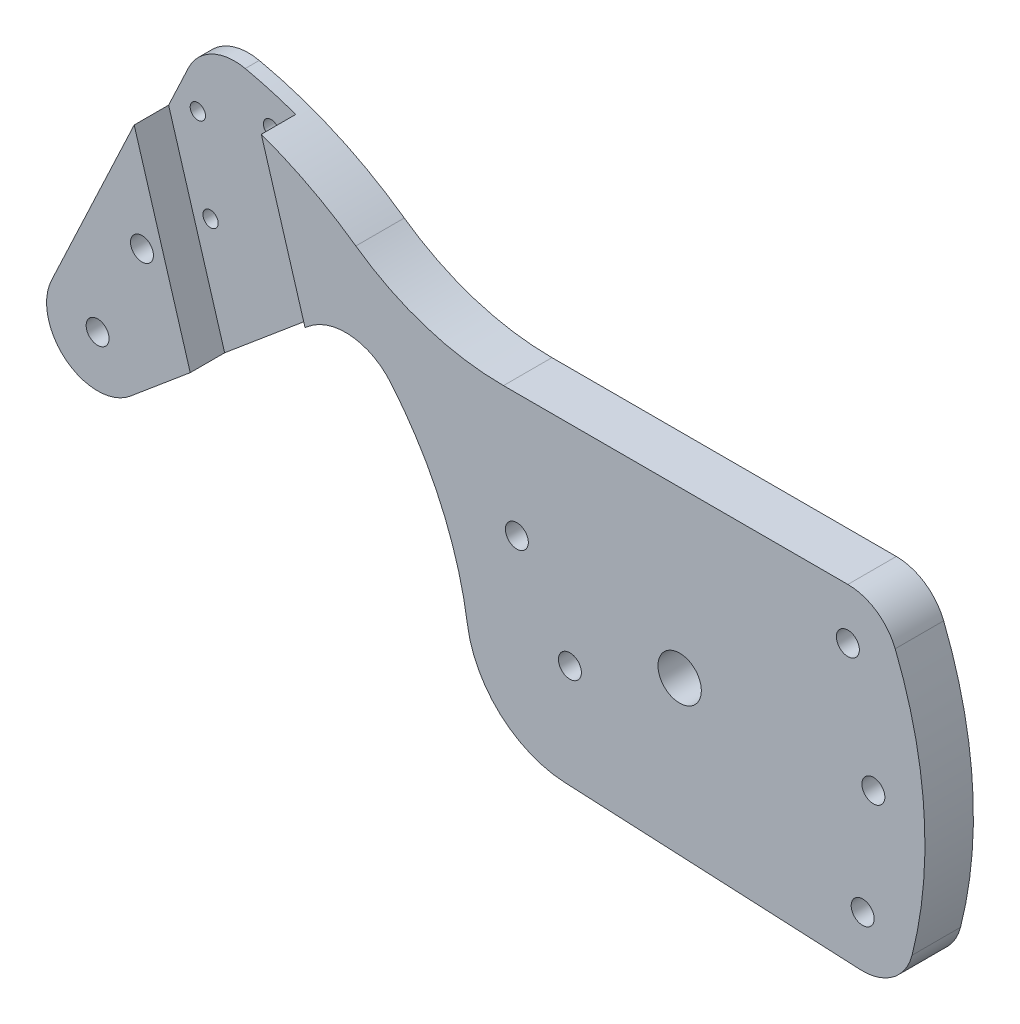
ISO-10303-21;
HEADER;
FILE_DESCRIPTION(('STEP AP214'),'2;1');
FILE_NAME('part.step','',(''),(''),'','','');
FILE_SCHEMA(('AUTOMOTIVE_DESIGN { 1 0 10303 214 1 1 1 1 }'));
ENDSEC;
DATA;
#1=APPLICATION_CONTEXT('core data for automotive mechanical design processes');
#2=APPLICATION_PROTOCOL_DEFINITION('international standard','automotive_design',2000,#1);
#3=PRODUCT_CONTEXT('',#1,'mechanical');
#4=PRODUCT('Part','Part','',(#3));
#5=PRODUCT_RELATED_PRODUCT_CATEGORY('part','',(#4));
#6=PRODUCT_DEFINITION_FORMATION('','',#4);
#7=PRODUCT_DEFINITION_CONTEXT('part definition',#1,'design');
#8=PRODUCT_DEFINITION('design','',#6,#7);
#9=PRODUCT_DEFINITION_SHAPE('','',#8);
#10=(LENGTH_UNIT() NAMED_UNIT(*) SI_UNIT(.MILLI.,.METRE.));
#11=(NAMED_UNIT(*) PLANE_ANGLE_UNIT() SI_UNIT($,.RADIAN.));
#12=(NAMED_UNIT(*) SI_UNIT($,.STERADIAN.) SOLID_ANGLE_UNIT());
#13=UNCERTAINTY_MEASURE_WITH_UNIT(LENGTH_MEASURE(1.E-05),#10,'distance_accuracy_value','');
#14=(GEOMETRIC_REPRESENTATION_CONTEXT(3) GLOBAL_UNCERTAINTY_ASSIGNED_CONTEXT((#13)) GLOBAL_UNIT_ASSIGNED_CONTEXT((#10,
#11,#12)) REPRESENTATION_CONTEXT('',''));
#15=CARTESIAN_POINT('',(0.,0.,0.));
#16=DIRECTION('',(0.,0.,1.));
#17=DIRECTION('',(1.,0.,0.));
#18=AXIS2_PLACEMENT_3D('',#15,#16,#17);
#19=CARTESIAN_POINT('',(-74.1892847970259,-68.5571228840362,-2.));
#20=DIRECTION('',(-0.95769511445002,-0.287784759427187,0.));
#21=DIRECTION('',(0.287784759427187,-0.95769511445002,0.));
#22=AXIS2_PLACEMENT_3D('',#19,#20,#21);
#23=PLANE('',#22);
#24=DIRECTION('',(-0.287784759427187,0.95769511445002,0.));
#25=VECTOR('',#24,1.);
#26=CARTESIAN_POINT('',(-74.1892847970259,-68.5571228840362,-2.));
#27=LINE('',#26,#25);
#28=CARTESIAN_POINT('',(-95.9576660688243,3.88407391520334,-2.));
#29=VERTEX_POINT('',#28);
#30=CARTESIAN_POINT('',(-106.945535827358,40.4496974975837,-2.));
#31=VERTEX_POINT('',#30);
#32=EDGE_CURVE('E11',#29,#31,#27,.T.);
#33=ORIENTED_EDGE('',*,*,#32,.T.);
#34=DIRECTION('',(0.,0.,1.));
#35=VECTOR('',#34,1.);
#36=CARTESIAN_POINT('',(-106.945535827358,40.4496974975837,4.75));
#37=LINE('',#36,#35);
#38=CARTESIAN_POINT('',(-106.945535827358,40.4496974975837,4.75));
#39=VERTEX_POINT('',#38);
#40=EDGE_CURVE('E398',#31,#39,#37,.T.);
#41=ORIENTED_EDGE('',*,*,#40,.T.);
#42=DIRECTION('',(0.287784759427187,-0.95769511445002,0.));
#43=VECTOR('',#42,1.);
#44=CARTESIAN_POINT('',(-86.9399558255523,-26.1252186571247,4.75));
#45=LINE('',#44,#43);
#46=CARTESIAN_POINT('',(-95.9576660688243,3.88407391520334,4.75));
#47=VERTEX_POINT('',#46);
#48=EDGE_CURVE('E66',#39,#47,#45,.T.);
#49=ORIENTED_EDGE('',*,*,#48,.T.);
#50=DIRECTION('',(0.,0.,1.));
#51=VECTOR('',#50,1.);
#52=CARTESIAN_POINT('',(-95.9576660688243,3.88407391520334,4.75));
#53=LINE('',#52,#51);
#54=EDGE_CURVE('E426',#29,#47,#53,.T.);
#55=ORIENTED_EDGE('',*,*,#54,.F.);
#56=EDGE_LOOP('',(#33,#41,#49,#55));
#57=FACE_BOUND('',#56,.T.);
#58=ADVANCED_FACE('F40',(#57),#23,.F.);
#59=CARTESIAN_POINT('',(-48.3315167068753,-60.7869343795021,-2.));
#60=DIRECTION('',(0.95769511445002,0.287784759427187,0.));
#61=DIRECTION('',(-0.287784759427187,0.95769511445002,0.));
#62=AXIS2_PLACEMENT_3D('',#59,#60,#61);
#63=PLANE('',#62);
#64=DIRECTION('',(-0.287784759427187,0.95769511445002,0.));
#65=VECTOR('',#64,1.);
#66=CARTESIAN_POINT('',(-61.0821877354018,-18.3550301525907,4.75));
#67=LINE('',#66,#65);
#68=CARTESIAN_POINT('',(-73.4421904308482,22.7768012188099,4.75));
#69=VERTEX_POINT('',#68);
#70=CARTESIAN_POINT('',(-82.0220970357489,51.329163249051,4.75));
#71=VERTEX_POINT('',#70);
#72=EDGE_CURVE('E396',#69,#71,#67,.T.);
#73=ORIENTED_EDGE('',*,*,#72,.T.);
#74=DIRECTION('',(0.,0.,-1.));
#75=VECTOR('',#74,1.);
#76=CARTESIAN_POINT('',(-82.0220970357489,51.3291632490509,4.75));
#77=LINE('',#76,#75);
#78=CARTESIAN_POINT('',(-82.0220970357489,51.3291632490509,-2.));
#79=VERTEX_POINT('',#78);
#80=EDGE_CURVE('E58',#79,#71,#77,.F.);
#81=ORIENTED_EDGE('',*,*,#80,.F.);
#82=DIRECTION('',(-0.287784759427187,0.95769511445002,0.));
#83=VECTOR('',#82,1.);
#84=CARTESIAN_POINT('',(-48.3315167068753,-60.7869343795021,-2.));
#85=LINE('',#84,#83);
#86=CARTESIAN_POINT('',(-73.4421904308482,22.7768012188099,-2.));
#87=VERTEX_POINT('',#86);
#88=EDGE_CURVE('E50',#87,#79,#85,.T.);
#89=ORIENTED_EDGE('',*,*,#88,.F.);
#90=DIRECTION('',(0.,0.,-1.));
#91=VECTOR('',#90,1.);
#92=CARTESIAN_POINT('',(-73.4421904308482,22.7768012188099,4.75));
#93=LINE('',#92,#91);
#94=EDGE_CURVE('E44',#69,#87,#93,.T.);
#95=ORIENTED_EDGE('',*,*,#94,.F.);
#96=EDGE_LOOP('',(#73,#81,#89,#95));
#97=FACE_BOUND('',#96,.T.);
#98=ADVANCED_FACE('F42',(#97),#63,.F.);
#99=CARTESIAN_POINT('',(0.,0.,-2.));
#100=DIRECTION('',(0.,0.,1.));
#101=DIRECTION('',(1.,0.,0.));
#102=AXIS2_PLACEMENT_3D('',#99,#100,#101);
#103=PLANE('',#102);
#104=DIRECTION('',(0.766044443118982,0.642787609686534,0.));
#105=VECTOR('',#104,1.);
#106=CARTESIAN_POINT('',(-41.5599291638823,49.5291948890183,-2.));
#107=LINE('',#106,#105);
#108=EDGE_CURVE('E206',#29,#87,#107,.T.);
#109=ORIENTED_EDGE('',*,*,#108,.T.);
#110=ORIENTED_EDGE('',*,*,#88,.T.);
#111=CARTESIAN_POINT('',(-108.317782272363,-21.5,-2.));
#112=DIRECTION('',(0.,0.,-1.));
#113=DIRECTION('',(-1.,0.,0.));
#114=AXIS2_PLACEMENT_3D('',#111,#112,#113);
#115=CIRCLE('',#114,77.4309374967139);
#116=CARTESIAN_POINT('',(-91.9187421242096,54.174444588905,-2.));
#117=VERTEX_POINT('',#116);
#118=EDGE_CURVE('E181',#117,#79,#115,.T.);
#119=ORIENTED_EDGE('',*,*,#118,.F.);
#120=CARTESIAN_POINT('',(-94.0366346201967,44.4012909844925,-2.));
#121=DIRECTION('',(0.,0.,1.));
#122=DIRECTION('',(1.,0.,0.));
#123=AXIS2_PLACEMENT_3D('',#120,#121,#122);
#124=CIRCLE('',#123,9.99999999999998);
#125=CARTESIAN_POINT('',(-103.085929893281,48.6569055183213,-2.));
#126=VERTEX_POINT('',#125);
#127=EDGE_CURVE('E437',#117,#126,#124,.T.);
#128=ORIENTED_EDGE('',*,*,#127,.T.);
#129=DIRECTION('',(-0.425561453382882,-0.904929527308425,0.));
#130=VECTOR('',#129,1.);
#131=CARTESIAN_POINT('',(-103.154731418742,48.5106034239492,-2.));
#132=LINE('',#131,#130);
#133=EDGE_CURVE('E405',#126,#31,#132,.T.);
#134=ORIENTED_EDGE('',*,*,#133,.T.);
#135=ORIENTED_EDGE('',*,*,#32,.F.);
#136=EDGE_LOOP('',(#109,#110,#119,#128,#134,#135));
#137=FACE_BOUND('',#136,.T.);
#138=CARTESIAN_POINT('',(-98.7212448544347,25.2426264445703,-2.));
#139=DIRECTION('',(0.,0.,-1.));
#140=DIRECTION('',(-1.,0.,0.));
#141=AXIS2_PLACEMENT_3D('',#138,#139,#140);
#142=CIRCLE('',#141,1.5);
#143=CARTESIAN_POINT('',(-100.221244854435,25.2426264445703,-2.));
#144=VERTEX_POINT('',#143);
#145=EDGE_CURVE('E409',#144,#144,#142,.F.);
#146=ORIENTED_EDGE('',*,*,#145,.F.);
#147=EDGE_LOOP('',(#146));
#148=FACE_BOUND('',#147,.T.);
#149=CARTESIAN_POINT('',(-101.219347978572,42.2429052887889,-2.));
#150=DIRECTION('',(0.,0.,-1.));
#151=DIRECTION('',(-1.,0.,0.));
#152=AXIS2_PLACEMENT_3D('',#149,#150,#151);
#153=CIRCLE('',#152,1.5);
#154=CARTESIAN_POINT('',(-102.719347978572,42.2429052887889,-2.));
#155=VERTEX_POINT('',#154);
#156=EDGE_CURVE('E413',#155,#155,#153,.F.);
#157=ORIENTED_EDGE('',*,*,#156,.F.);
#158=EDGE_LOOP('',(#157));
#159=FACE_BOUND('',#158,.T.);
#160=CARTESIAN_POINT('',(-86.8539212618216,46.5596766801966,-2.));
#161=DIRECTION('',(0.,0.,-1.));
#162=DIRECTION('',(-1.,0.,0.));
#163=AXIS2_PLACEMENT_3D('',#160,#161,#162);
#164=CIRCLE('',#163,1.5);
#165=CARTESIAN_POINT('',(-88.3539212618216,46.5596766801966,-2.));
#166=VERTEX_POINT('',#165);
#167=EDGE_CURVE('E417',#166,#166,#164,.F.);
#168=ORIENTED_EDGE('',*,*,#167,.F.);
#169=EDGE_LOOP('',(#168));
#170=FACE_BOUND('',#169,.T.);
#171=CARTESIAN_POINT('',(-79.5673425654343,30.998321633114,-2.));
#172=DIRECTION('',(0.,0.,-1.));
#173=DIRECTION('',(-1.,0.,0.));
#174=AXIS2_PLACEMENT_3D('',#171,#172,#173);
#175=CIRCLE('',#174,1.5);
#176=CARTESIAN_POINT('',(-81.0673425654343,30.998321633114,-2.));
#177=VERTEX_POINT('',#176);
#178=EDGE_CURVE('E408',#177,#177,#175,.F.);
#179=ORIENTED_EDGE('',*,*,#178,.F.);
#180=EDGE_LOOP('',(#179));
#181=FACE_BOUND('',#180,.T.);
#182=ADVANCED_FACE('F508',(#137,#148,#159,#170,#181),#103,.T.);
#183=CARTESIAN_POINT('',(0.,0.,4.75));
#184=DIRECTION('',(0.,0.,1.));
#185=DIRECTION('',(1.,0.,0.));
#186=AXIS2_PLACEMENT_3D('',#183,#184,#185);
#187=PLANE('',#186);
#188=ORIENTED_EDGE('',*,*,#72,.F.);
#189=DIRECTION('',(0.766044443118982,0.642787609686535,0.));
#190=VECTOR('',#189,1.);
#191=CARTESIAN_POINT('',(-41.5599291638824,49.5291948890183,4.75));
#192=LINE('',#191,#190);
#193=CARTESIAN_POINT('',(-72.8648183450266,23.2612739230748,4.75));
#194=VERTEX_POINT('',#193);
#195=EDGE_CURVE('E215',#69,#194,#192,.T.);
#196=ORIENTED_EDGE('',*,*,#195,.T.);
#197=CARTESIAN_POINT('',(-65.4725042221845,14.4514570095927,4.75));
#198=DIRECTION('',(0.,0.,1.));
#199=DIRECTION('',(1.,0.,0.));
#200=AXIS2_PLACEMENT_3D('',#197,#198,#199);
#201=CIRCLE('',#200,11.5003992165423);
#202=CARTESIAN_POINT('',(-56.6626873087024,21.8437711324349,4.75));
#203=VERTEX_POINT('',#202);
#204=EDGE_CURVE('E219',#203,#194,#201,.T.);
#205=ORIENTED_EDGE('',*,*,#204,.F.);
#206=CARTESIAN_POINT('',(-108.317782272363,-21.5,4.75));
#207=DIRECTION('',(0.,0.,1.));
#208=DIRECTION('',(1.,0.,0.));
#209=AXIS2_PLACEMENT_3D('',#206,#207,#208);
#210=CIRCLE('',#209,67.4309374967139);
#211=CARTESIAN_POINT('',(-41.6082780723541,-11.662653758524,4.75));
#212=VERTEX_POINT('',#211);
#213=EDGE_CURVE('E223',#212,#203,#210,.T.);
#214=ORIENTED_EDGE('',*,*,#213,.F.);
#215=CARTESIAN_POINT('',(-21.5177822723635,-8.70000000000001,4.75));
#216=DIRECTION('',(0.,0.,1.));
#217=DIRECTION('',(1.,0.,0.));
#218=AXIS2_PLACEMENT_3D('',#215,#216,#217);
#219=CIRCLE('',#218,20.3077654797946);
#220=CARTESIAN_POINT('',(-22.5002308320871,-28.9839871230938,4.75));
#221=VERTEX_POINT('',#220);
#222=EDGE_CURVE('E227',#212,#221,#219,.T.);
#223=ORIENTED_EDGE('',*,*,#222,.T.);
#224=DIRECTION('',(-0.998829100290503,0.0483779744601208,0.));
#225=VECTOR('',#224,1.);
#226=CARTESIAN_POINT('',(-1.45320494845944,-30.0033932260633,4.75));
#227=LINE('',#226,#225);
#228=CARTESIAN_POINT('',(35.3984379830354,-31.788291002905,4.75));
#229=VERTEX_POINT('',#228);
#230=EDGE_CURVE('E230',#229,#221,#227,.T.);
#231=ORIENTED_EDGE('',*,*,#230,.F.);
#232=CARTESIAN_POINT('',(35.8822177276366,-21.8,4.75));
#233=DIRECTION('',(0.,0.,1.));
#234=DIRECTION('',(1.,0.,0.));
#235=AXIS2_PLACEMENT_3D('',#232,#233,#234);
#236=CIRCLE('',#235,9.99999999999999);
#237=CARTESIAN_POINT('',(45.5722671365024,-24.2704134175759,4.75));
#238=VERTEX_POINT('',#237);
#239=EDGE_CURVE('E234',#229,#238,#236,.T.);
#240=ORIENTED_EDGE('',*,*,#239,.T.);
#241=CARTESIAN_POINT('',(-33.3576699128129,-4.14775280898879,4.75));
#242=DIRECTION('',(0.,0.,1.));
#243=DIRECTION('',(1.,0.,0.));
#244=AXIS2_PLACEMENT_3D('',#241,#242,#243);
#245=CIRCLE('',#244,81.4546280611314);
#246=CARTESIAN_POINT('',(42.2664151883936,26.1153300673927,4.75));
#247=VERTEX_POINT('',#246);
#248=EDGE_CURVE('E237',#238,#247,#245,.T.);
#249=ORIENTED_EDGE('',*,*,#248,.T.);
#250=CARTESIAN_POINT('',(32.9822177276365,22.4,4.75));
#251=DIRECTION('',(0.,0.,1.));
#252=DIRECTION('',(1.,0.,0.));
#253=AXIS2_PLACEMENT_3D('',#250,#251,#252);
#254=CIRCLE('',#253,9.99999999999999);
#255=CARTESIAN_POINT('',(32.9822177276365,32.4,4.75));
#256=VERTEX_POINT('',#255);
#257=EDGE_CURVE('E240',#247,#256,#254,.T.);
#258=ORIENTED_EDGE('',*,*,#257,.T.);
#259=DIRECTION('',(1.,0.,0.));
#260=VECTOR('',#259,1.);
#261=CARTESIAN_POINT('',(0.,32.4,4.75));
#262=LINE('',#261,#260);
#263=CARTESIAN_POINT('',(-34.5381520802066,32.4,4.75));
#264=VERTEX_POINT('',#263);
#265=EDGE_CURVE('E195',#264,#256,#262,.T.);
#266=ORIENTED_EDGE('',*,*,#265,.F.);
#267=CARTESIAN_POINT('',(-34.5381520802066,82.4,4.75));
#268=DIRECTION('',(0.,0.,1.));
#269=DIRECTION('',(1.,0.,0.));
#270=AXIS2_PLACEMENT_3D('',#267,#268,#269);
#271=CIRCLE('',#270,50.);
#272=CARTESIAN_POINT('',(-63.4870210289497,41.6328197370912,4.75));
#273=VERTEX_POINT('',#272);
#274=EDGE_CURVE('E174',#273,#264,#271,.T.);
#275=ORIENTED_EDGE('',*,*,#274,.F.);
#276=CARTESIAN_POINT('',(-108.317782272363,-21.5,4.75));
#277=DIRECTION('',(0.,0.,1.));
#278=DIRECTION('',(1.,0.,0.));
#279=AXIS2_PLACEMENT_3D('',#276,#277,#278);
#280=CIRCLE('',#279,77.4309374967139);
#281=EDGE_CURVE('E185',#273,#71,#280,.T.);
#282=ORIENTED_EDGE('',*,*,#281,.T.);
#283=EDGE_LOOP('',(#188,#196,#205,#214,#223,#231,#240,#249,#258,#266,#275,#282));
#284=FACE_BOUND('',#283,.T.);
#285=CARTESIAN_POINT('',(0.,0.,4.75));
#286=DIRECTION('',(0.,0.,1.));
#287=DIRECTION('',(1.,0.,0.));
#288=AXIS2_PLACEMENT_3D('',#285,#286,#287);
#289=CIRCLE('',#288,4.25);
#290=CARTESIAN_POINT('',(4.25,0.,4.75));
#291=VERTEX_POINT('',#290);
#292=EDGE_CURVE('E264',#291,#291,#289,.T.);
#293=ORIENTED_EDGE('',*,*,#292,.F.);
#294=EDGE_LOOP('',(#293));
#295=FACE_BOUND('',#294,.T.);
#296=CARTESIAN_POINT('',(-31.9177822723635,8.19999999999999,4.75));
#297=DIRECTION('',(0.,0.,1.));
#298=DIRECTION('',(1.,0.,0.));
#299=AXIS2_PLACEMENT_3D('',#296,#297,#298);
#300=CIRCLE('',#299,2.25);
#301=CARTESIAN_POINT('',(-29.6677822723635,8.19999999999999,4.75));
#302=VERTEX_POINT('',#301);
#303=EDGE_CURVE('E260',#302,#302,#300,.T.);
#304=ORIENTED_EDGE('',*,*,#303,.F.);
#305=EDGE_LOOP('',(#304));
#306=FACE_BOUND('',#305,.T.);
#307=CARTESIAN_POINT('',(-21.5177822723635,-8.70000000000001,4.75));
#308=DIRECTION('',(0.,0.,1.));
#309=DIRECTION('',(1.,0.,0.));
#310=AXIS2_PLACEMENT_3D('',#307,#308,#309);
#311=CIRCLE('',#310,2.25);
#312=CARTESIAN_POINT('',(-19.2677822723635,-8.70000000000001,4.75));
#313=VERTEX_POINT('',#312);
#314=EDGE_CURVE('E256',#313,#313,#311,.T.);
#315=ORIENTED_EDGE('',*,*,#314,.F.);
#316=EDGE_LOOP('',(#315));
#317=FACE_BOUND('',#316,.T.);
#318=CARTESIAN_POINT('',(32.9822177276365,22.4,4.75));
#319=DIRECTION('',(0.,0.,1.));
#320=DIRECTION('',(1.,0.,0.));
#321=AXIS2_PLACEMENT_3D('',#318,#319,#320);
#322=CIRCLE('',#321,2.25);
#323=CARTESIAN_POINT('',(35.2322177276365,22.4,4.75));
#324=VERTEX_POINT('',#323);
#325=EDGE_CURVE('E252',#324,#324,#322,.T.);
#326=ORIENTED_EDGE('',*,*,#325,.F.);
#327=EDGE_LOOP('',(#326));
#328=FACE_BOUND('',#327,.T.);
#329=CARTESIAN_POINT('',(37.9822177276365,-0.100000000000011,4.75));
#330=DIRECTION('',(0.,0.,1.));
#331=DIRECTION('',(1.,0.,0.));
#332=AXIS2_PLACEMENT_3D('',#329,#330,#331);
#333=CIRCLE('',#332,2.25);
#334=CARTESIAN_POINT('',(40.2322177276366,-0.100000000000011,4.75));
#335=VERTEX_POINT('',#334);
#336=EDGE_CURVE('E248',#335,#335,#333,.T.);
#337=ORIENTED_EDGE('',*,*,#336,.F.);
#338=EDGE_LOOP('',(#337));
#339=FACE_BOUND('',#338,.T.);
#340=CARTESIAN_POINT('',(35.8822177276366,-21.8,4.75));
#341=DIRECTION('',(0.,0.,1.));
#342=DIRECTION('',(1.,0.,0.));
#343=AXIS2_PLACEMENT_3D('',#340,#341,#342);
#344=CIRCLE('',#343,2.25);
#345=CARTESIAN_POINT('',(38.1322177276366,-21.8,4.75));
#346=VERTEX_POINT('',#345);
#347=EDGE_CURVE('E244',#346,#346,#344,.T.);
#348=ORIENTED_EDGE('',*,*,#347,.F.);
#349=EDGE_LOOP('',(#348));
#350=FACE_BOUND('',#349,.T.);
#351=ADVANCED_FACE('F192',(#284,#295,#306,#317,#328,#339,#350),#187,.T.);
#352=CARTESIAN_POINT('',(-79.5673425654343,30.998321633114,-4.75));
#353=DIRECTION('',(0.,0.,1.));
#354=DIRECTION('',(1.,0.,0.));
#355=AXIS2_PLACEMENT_3D('',#352,#353,#354);
#356=CYLINDRICAL_SURFACE('',#355,1.5);
#357=ORIENTED_EDGE('',*,*,#178,.T.);
#358=EDGE_LOOP('',(#357));
#359=FACE_BOUND('',#358,.T.);
#360=CARTESIAN_POINT('',(-79.5673425654343,30.998321633114,-4.75));
#361=DIRECTION('',(0.,0.,1.));
#362=DIRECTION('',(1.,0.,0.));
#363=AXIS2_PLACEMENT_3D('',#360,#361,#362);
#364=CIRCLE('',#363,1.5);
#365=CARTESIAN_POINT('',(-78.0673425654343,30.998321633114,-4.75));
#366=VERTEX_POINT('',#365);
#367=EDGE_CURVE('E965',#366,#366,#364,.T.);
#368=ORIENTED_EDGE('',*,*,#367,.F.);
#369=EDGE_LOOP('',(#368));
#370=FACE_BOUND('',#369,.T.);
#371=ADVANCED_FACE('F564',(#359,#370),#356,.F.);
#372=CARTESIAN_POINT('',(-86.8539212618216,46.5596766801966,-4.75));
#373=DIRECTION('',(0.,0.,1.));
#374=DIRECTION('',(1.,0.,0.));
#375=AXIS2_PLACEMENT_3D('',#372,#373,#374);
#376=CYLINDRICAL_SURFACE('',#375,1.5);
#377=ORIENTED_EDGE('',*,*,#167,.T.);
#378=EDGE_LOOP('',(#377));
#379=FACE_BOUND('',#378,.T.);
#380=CARTESIAN_POINT('',(-86.8539212618216,46.5596766801966,-4.75));
#381=DIRECTION('',(0.,0.,1.));
#382=DIRECTION('',(1.,0.,0.));
#383=AXIS2_PLACEMENT_3D('',#380,#381,#382);
#384=CIRCLE('',#383,1.5);
#385=CARTESIAN_POINT('',(-85.3539212618216,46.5596766801966,-4.75));
#386=VERTEX_POINT('',#385);
#387=EDGE_CURVE('E962',#386,#386,#384,.T.);
#388=ORIENTED_EDGE('',*,*,#387,.F.);
#389=EDGE_LOOP('',(#388));
#390=FACE_BOUND('',#389,.T.);
#391=ADVANCED_FACE('F557',(#379,#390),#376,.F.);
#392=CARTESIAN_POINT('',(-101.219347978572,42.2429052887889,-4.75));
#393=DIRECTION('',(0.,0.,1.));
#394=DIRECTION('',(1.,0.,0.));
#395=AXIS2_PLACEMENT_3D('',#392,#393,#394);
#396=CYLINDRICAL_SURFACE('',#395,1.5);
#397=ORIENTED_EDGE('',*,*,#156,.T.);
#398=EDGE_LOOP('',(#397));
#399=FACE_BOUND('',#398,.T.);
#400=CARTESIAN_POINT('',(-101.219347978572,42.2429052887889,-4.75));
#401=DIRECTION('',(0.,0.,1.));
#402=DIRECTION('',(1.,0.,0.));
#403=AXIS2_PLACEMENT_3D('',#400,#401,#402);
#404=CIRCLE('',#403,1.5);
#405=CARTESIAN_POINT('',(-99.7193479785719,42.2429052887889,-4.75));
#406=VERTEX_POINT('',#405);
#407=EDGE_CURVE('E958',#406,#406,#404,.T.);
#408=ORIENTED_EDGE('',*,*,#407,.F.);
#409=EDGE_LOOP('',(#408));
#410=FACE_BOUND('',#409,.T.);
#411=ADVANCED_FACE('F551',(#399,#410),#396,.F.);
#412=CARTESIAN_POINT('',(-98.7212448544347,25.2426264445703,-4.75));
#413=DIRECTION('',(0.,0.,1.));
#414=DIRECTION('',(1.,0.,0.));
#415=AXIS2_PLACEMENT_3D('',#412,#413,#414);
#416=CYLINDRICAL_SURFACE('',#415,1.5);
#417=ORIENTED_EDGE('',*,*,#145,.T.);
#418=EDGE_LOOP('',(#417));
#419=FACE_BOUND('',#418,.T.);
#420=CARTESIAN_POINT('',(-98.7212448544347,25.2426264445703,-4.75));
#421=DIRECTION('',(0.,0.,1.));
#422=DIRECTION('',(1.,0.,0.));
#423=AXIS2_PLACEMENT_3D('',#420,#421,#422);
#424=CIRCLE('',#423,1.5);
#425=CARTESIAN_POINT('',(-97.2212448544347,25.2426264445703,-4.75));
#426=VERTEX_POINT('',#425);
#427=EDGE_CURVE('E441',#426,#426,#424,.T.);
#428=ORIENTED_EDGE('',*,*,#427,.F.);
#429=EDGE_LOOP('',(#428));
#430=FACE_BOUND('',#429,.T.);
#431=ADVANCED_FACE('F546',(#419,#430),#416,.F.);
#432=CARTESIAN_POINT('',(-94.0366346201967,44.4012909844925,4.75));
#433=DIRECTION('',(0.,0.,-1.));
#434=DIRECTION('',(-1.,0.,0.));
#435=AXIS2_PLACEMENT_3D('',#432,#433,#434);
#436=CYLINDRICAL_SURFACE('',#435,9.99999999999999);
#437=DIRECTION('',(0.,0.,-1.));
#438=VECTOR('',#437,1.);
#439=CARTESIAN_POINT('',(-103.085929893281,48.6569055183213,4.75));
#440=LINE('',#439,#438);
#441=CARTESIAN_POINT('',(-103.085929893281,48.6569055183213,-4.75));
#442=VERTEX_POINT('',#441);
#443=EDGE_CURVE('E389',#126,#442,#440,.T.);
#444=ORIENTED_EDGE('',*,*,#443,.F.);
#445=ORIENTED_EDGE('',*,*,#127,.F.);
#446=DIRECTION('',(0.,0.,-1.));
#447=VECTOR('',#446,1.);
#448=CARTESIAN_POINT('',(-91.9187421242096,54.174444588905,4.75));
#449=LINE('',#448,#447);
#450=CARTESIAN_POINT('',(-91.9187421242096,54.174444588905,-4.75));
#451=VERTEX_POINT('',#450);
#452=EDGE_CURVE('E182',#117,#451,#449,.T.);
#453=ORIENTED_EDGE('',*,*,#452,.T.);
#454=CARTESIAN_POINT('',(-94.0366346201967,44.4012909844925,-4.75));
#455=DIRECTION('',(0.,0.,1.));
#456=DIRECTION('',(1.,0.,0.));
#457=AXIS2_PLACEMENT_3D('',#454,#455,#456);
#458=CIRCLE('',#457,9.99999999999999);
#459=EDGE_CURVE('E282',#451,#442,#458,.T.);
#460=ORIENTED_EDGE('',*,*,#459,.T.);
#461=EDGE_LOOP('',(#444,#445,#453,#460));
#462=FACE_BOUND('',#461,.T.);
#463=ADVANCED_FACE('F505',(#462),#436,.T.);
#464=CARTESIAN_POINT('',(-41.5599291638824,49.5291948890183,4.75));
#465=DIRECTION('',(-0.642787609686535,0.766044443118982,0.));
#466=DIRECTION('',(-0.766044443118982,-0.642787609686535,0.));
#467=AXIS2_PLACEMENT_3D('',#464,#465,#466);
#468=PLANE('',#467);
#469=ORIENTED_EDGE('',*,*,#195,.F.);
#470=ORIENTED_EDGE('',*,*,#94,.T.);
#471=ORIENTED_EDGE('',*,*,#108,.F.);
#472=ORIENTED_EDGE('',*,*,#54,.T.);
#473=CARTESIAN_POINT('',(-107.689906175498,-5.96044443118984,4.75));
#474=VERTEX_POINT('',#473);
#475=EDGE_CURVE('E216',#474,#47,#192,.T.);
#476=ORIENTED_EDGE('',*,*,#475,.F.);
#477=DIRECTION('',(0.,0.,-1.));
#478=VECTOR('',#477,1.);
#479=CARTESIAN_POINT('',(-107.689906175498,-5.96044443118984,4.75));
#480=LINE('',#479,#478);
#481=CARTESIAN_POINT('',(-107.689906175498,-5.96044443118984,-4.75));
#482=VERTEX_POINT('',#481);
#483=EDGE_CURVE('E382',#474,#482,#480,.T.);
#484=ORIENTED_EDGE('',*,*,#483,.T.);
#485=DIRECTION('',(0.766044443118982,0.642787609686535,0.));
#486=VECTOR('',#485,1.);
#487=CARTESIAN_POINT('',(-41.5599291638824,49.5291948890183,-4.75));
#488=LINE('',#487,#486);
#489=CARTESIAN_POINT('',(-72.8648183450266,23.2612739230748,-4.75));
#490=VERTEX_POINT('',#489);
#491=EDGE_CURVE('E293',#482,#490,#488,.T.);
#492=ORIENTED_EDGE('',*,*,#491,.T.);
#493=DIRECTION('',(0.,0.,-1.));
#494=VECTOR('',#493,1.);
#495=CARTESIAN_POINT('',(-72.8648183450266,23.2612739230748,4.75));
#496=LINE('',#495,#494);
#497=EDGE_CURVE('E379',#194,#490,#496,.T.);
#498=ORIENTED_EDGE('',*,*,#497,.F.);
#499=EDGE_LOOP('',(#469,#470,#471,#472,#476,#484,#492,#498));
#500=FACE_BOUND('',#499,.T.);
#501=ADVANCED_FACE('F462',(#500),#468,.F.);
#502=CARTESIAN_POINT('',(-34.5381520802066,82.4,4.75));
#503=DIRECTION('',(0.,0.,-1.));
#504=DIRECTION('',(-1.,0.,0.));
#505=AXIS2_PLACEMENT_3D('',#502,#503,#504);
#506=CYLINDRICAL_SURFACE('',#505,50.);
#507=CARTESIAN_POINT('',(-34.5381520802066,82.4,-4.75));
#508=DIRECTION('',(0.,0.,1.));
#509=DIRECTION('',(1.,0.,0.));
#510=AXIS2_PLACEMENT_3D('',#507,#508,#509);
#511=CIRCLE('',#510,50.);
#512=CARTESIAN_POINT('',(-63.4870210289497,41.6328197370912,-4.75));
#513=VERTEX_POINT('',#512);
#514=CARTESIAN_POINT('',(-34.5381520802066,32.4,-4.75));
#515=VERTEX_POINT('',#514);
#516=EDGE_CURVE('E177',#513,#515,#511,.T.);
#517=ORIENTED_EDGE('',*,*,#516,.F.);
#518=DIRECTION('',(0.,0.,-1.));
#519=VECTOR('',#518,1.);
#520=CARTESIAN_POINT('',(-63.4870210289497,41.6328197370912,4.75));
#521=LINE('',#520,#519);
#522=EDGE_CURVE('E171',#273,#513,#521,.T.);
#523=ORIENTED_EDGE('',*,*,#522,.F.);
#524=ORIENTED_EDGE('',*,*,#274,.T.);
#525=DIRECTION('',(0.,0.,-1.));
#526=VECTOR('',#525,1.);
#527=CARTESIAN_POINT('',(-34.5381520802066,32.4,4.75));
#528=LINE('',#527,#526);
#529=EDGE_CURVE('E276',#264,#515,#528,.T.);
#530=ORIENTED_EDGE('',*,*,#529,.T.);
#531=EDGE_LOOP('',(#517,#523,#524,#530));
#532=FACE_BOUND('',#531,.T.);
#533=ADVANCED_FACE('F172',(#532),#506,.F.);
#534=CARTESIAN_POINT('',(-108.317782272363,-21.5,4.75));
#535=DIRECTION('',(0.,0.,-1.));
#536=DIRECTION('',(-1.,0.,0.));
#537=AXIS2_PLACEMENT_3D('',#534,#535,#536);
#538=CYLINDRICAL_SURFACE('',#537,77.4309374967139);
#539=ORIENTED_EDGE('',*,*,#118,.T.);
#540=ORIENTED_EDGE('',*,*,#80,.T.);
#541=ORIENTED_EDGE('',*,*,#281,.F.);
#542=ORIENTED_EDGE('',*,*,#522,.T.);
#543=CARTESIAN_POINT('',(-108.317782272363,-21.5,-4.75));
#544=DIRECTION('',(0.,0.,1.));
#545=DIRECTION('',(1.,0.,0.));
#546=AXIS2_PLACEMENT_3D('',#543,#544,#545);
#547=CIRCLE('',#546,77.4309374967139);
#548=EDGE_CURVE('E279',#513,#451,#547,.T.);
#549=ORIENTED_EDGE('',*,*,#548,.T.);
#550=ORIENTED_EDGE('',*,*,#452,.F.);
#551=EDGE_LOOP('',(#539,#540,#541,#542,#549,#550));
#552=FACE_BOUND('',#551,.T.);
#553=ADVANCED_FACE('F186',(#552),#538,.T.);
#554=CARTESIAN_POINT('',(-103.154731418742,48.5106034239492,4.75));
#555=DIRECTION('',(-0.904929527308425,0.425561453382882,0.));
#556=DIRECTION('',(-0.425561453382882,-0.904929527308425,0.));
#557=AXIS2_PLACEMENT_3D('',#554,#555,#556);
#558=PLANE('',#557);
#559=ORIENTED_EDGE('',*,*,#133,.F.);
#560=ORIENTED_EDGE('',*,*,#443,.T.);
#561=DIRECTION('',(0.425561453382882,0.904929527308425,0.));
#562=VECTOR('',#561,1.);
#563=CARTESIAN_POINT('',(-103.154731418742,48.5106034239492,-4.75));
#564=LINE('',#563,#562);
#565=CARTESIAN_POINT('',(-123.167077545448,5.9556145338288,-4.75));
#566=VERTEX_POINT('',#565);
#567=EDGE_CURVE('E286',#566,#442,#564,.T.);
#568=ORIENTED_EDGE('',*,*,#567,.F.);
#569=DIRECTION('',(0.,0.,-1.));
#570=VECTOR('',#569,1.);
#571=CARTESIAN_POINT('',(-123.167077545448,5.9556145338288,4.75));
#572=LINE('',#571,#570);
#573=CARTESIAN_POINT('',(-123.167077545448,5.9556145338288,4.75));
#574=VERTEX_POINT('',#573);
#575=EDGE_CURVE('E386',#574,#566,#572,.T.);
#576=ORIENTED_EDGE('',*,*,#575,.F.);
#577=DIRECTION('',(0.425561453382882,0.904929527308425,0.));
#578=VECTOR('',#577,1.);
#579=CARTESIAN_POINT('',(-103.154731418742,48.5106034239492,4.75));
#580=LINE('',#579,#578);
#581=EDGE_CURVE('E190',#574,#39,#580,.T.);
#582=ORIENTED_EDGE('',*,*,#581,.T.);
#583=ORIENTED_EDGE('',*,*,#40,.F.);
#584=EDGE_LOOP('',(#559,#560,#568,#576,#582,#583));
#585=FACE_BOUND('',#584,.T.);
#586=ADVANCED_FACE('F518',(#585),#558,.T.);
#587=CARTESIAN_POINT('',(-114.117782272363,1.69999999999999,4.75));
#588=DIRECTION('',(0.,0.,-1.));
#589=DIRECTION('',(-1.,0.,0.));
#590=AXIS2_PLACEMENT_3D('',#587,#588,#589);
#591=CYLINDRICAL_SURFACE('',#590,9.99999999999999);
#592=CARTESIAN_POINT('',(-114.117782272363,1.69999999999999,-4.75));
#593=DIRECTION('',(0.,0.,1.));
#594=DIRECTION('',(1.,0.,0.));
#595=AXIS2_PLACEMENT_3D('',#592,#593,#594);
#596=CIRCLE('',#595,9.99999999999999);
#597=EDGE_CURVE('E290',#566,#482,#596,.T.);
#598=ORIENTED_EDGE('',*,*,#597,.T.);
#599=ORIENTED_EDGE('',*,*,#483,.F.);
#600=CARTESIAN_POINT('',(-114.117782272363,1.69999999999999,4.75));
#601=DIRECTION('',(0.,0.,1.));
#602=DIRECTION('',(1.,0.,0.));
#603=AXIS2_PLACEMENT_3D('',#600,#601,#602);
#604=CIRCLE('',#603,9.99999999999999);
#605=EDGE_CURVE('E212',#574,#474,#604,.T.);
#606=ORIENTED_EDGE('',*,*,#605,.F.);
#607=ORIENTED_EDGE('',*,*,#575,.T.);
#608=EDGE_LOOP('',(#598,#599,#606,#607));
#609=FACE_BOUND('',#608,.T.);
#610=ADVANCED_FACE('F525',(#609),#591,.T.);
#611=CARTESIAN_POINT('',(-65.4725042221845,14.4514570095927,4.75));
#612=DIRECTION('',(0.,0.,-1.));
#613=DIRECTION('',(-1.,0.,0.));
#614=AXIS2_PLACEMENT_3D('',#611,#612,#613);
#615=CYLINDRICAL_SURFACE('',#614,11.5003992165423);
#616=CARTESIAN_POINT('',(-65.4725042221845,14.4514570095927,-4.75));
#617=DIRECTION('',(0.,0.,1.));
#618=DIRECTION('',(1.,0.,0.));
#619=AXIS2_PLACEMENT_3D('',#616,#617,#618);
#620=CIRCLE('',#619,11.5003992165423);
#621=CARTESIAN_POINT('',(-56.6626873087024,21.8437711324349,-4.75));
#622=VERTEX_POINT('',#621);
#623=EDGE_CURVE('E297',#622,#490,#620,.T.);
#624=ORIENTED_EDGE('',*,*,#623,.F.);
#625=DIRECTION('',(0.,0.,-1.));
#626=VECTOR('',#625,1.);
#627=CARTESIAN_POINT('',(-56.6626873087024,21.8437711324349,4.75));
#628=LINE('',#627,#626);
#629=EDGE_CURVE('E376',#203,#622,#628,.T.);
#630=ORIENTED_EDGE('',*,*,#629,.F.);
#631=ORIENTED_EDGE('',*,*,#204,.T.);
#632=ORIENTED_EDGE('',*,*,#497,.T.);
#633=EDGE_LOOP('',(#624,#630,#631,#632));
#634=FACE_BOUND('',#633,.T.);
#635=ADVANCED_FACE('F466',(#634),#615,.F.);
#636=CARTESIAN_POINT('',(-108.317782272363,-21.5,4.75));
#637=DIRECTION('',(0.,0.,-1.));
#638=DIRECTION('',(-1.,0.,0.));
#639=AXIS2_PLACEMENT_3D('',#636,#637,#638);
#640=CYLINDRICAL_SURFACE('',#639,67.4309374967139);
#641=CARTESIAN_POINT('',(-108.317782272363,-21.5,-4.75));
#642=DIRECTION('',(0.,0.,1.));
#643=DIRECTION('',(1.,0.,0.));
#644=AXIS2_PLACEMENT_3D('',#641,#642,#643);
#645=CIRCLE('',#644,67.4309374967139);
#646=CARTESIAN_POINT('',(-41.6082780723541,-11.662653758524,-4.75));
#647=VERTEX_POINT('',#646);
#648=EDGE_CURVE('E301',#647,#622,#645,.T.);
#649=ORIENTED_EDGE('',*,*,#648,.F.);
#650=DIRECTION('',(0.,0.,-1.));
#651=VECTOR('',#650,1.);
#652=CARTESIAN_POINT('',(-41.6082780723541,-11.662653758524,4.75));
#653=LINE('',#652,#651);
#654=EDGE_CURVE('E373',#212,#647,#653,.T.);
#655=ORIENTED_EDGE('',*,*,#654,.F.);
#656=ORIENTED_EDGE('',*,*,#213,.T.);
#657=ORIENTED_EDGE('',*,*,#629,.T.);
#658=EDGE_LOOP('',(#649,#655,#656,#657));
#659=FACE_BOUND('',#658,.T.);
#660=ADVANCED_FACE('F469',(#659),#640,.F.);
#661=CARTESIAN_POINT('',(-21.5177822723635,-8.70000000000001,4.75));
#662=DIRECTION('',(0.,0.,-1.));
#663=DIRECTION('',(-1.,0.,0.));
#664=AXIS2_PLACEMENT_3D('',#661,#662,#663);
#665=CYLINDRICAL_SURFACE('',#664,20.3077654797946);
#666=CARTESIAN_POINT('',(-21.5177822723635,-8.70000000000001,-4.75));
#667=DIRECTION('',(0.,0.,1.));
#668=DIRECTION('',(1.,0.,0.));
#669=AXIS2_PLACEMENT_3D('',#666,#667,#668);
#670=CIRCLE('',#669,20.3077654797946);
#671=CARTESIAN_POINT('',(-22.5002308320871,-28.9839871230938,-4.75));
#672=VERTEX_POINT('',#671);
#673=EDGE_CURVE('E305',#647,#672,#670,.T.);
#674=ORIENTED_EDGE('',*,*,#673,.T.);
#675=DIRECTION('',(0.,0.,-1.));
#676=VECTOR('',#675,1.);
#677=CARTESIAN_POINT('',(-22.5002308320871,-28.9839871230938,4.75));
#678=LINE('',#677,#676);
#679=EDGE_CURVE('E370',#221,#672,#678,.T.);
#680=ORIENTED_EDGE('',*,*,#679,.F.);
#681=ORIENTED_EDGE('',*,*,#222,.F.);
#682=ORIENTED_EDGE('',*,*,#654,.T.);
#683=EDGE_LOOP('',(#674,#680,#681,#682));
#684=FACE_BOUND('',#683,.T.);
#685=ADVANCED_FACE('F474',(#684),#665,.T.);
#686=CARTESIAN_POINT('',(-1.45320494845944,-30.0033932260633,4.75));
#687=DIRECTION('',(-0.0483779744601208,-0.998829100290503,0.));
#688=DIRECTION('',(0.998829100290503,-0.0483779744601208,0.));
#689=AXIS2_PLACEMENT_3D('',#686,#687,#688);
#690=PLANE('',#689);
#691=DIRECTION('',(-0.998829100290503,0.0483779744601208,0.));
#692=VECTOR('',#691,1.);
#693=CARTESIAN_POINT('',(-1.45320494845944,-30.0033932260633,-4.75));
#694=LINE('',#693,#692);
#695=CARTESIAN_POINT('',(35.3984379830354,-31.788291002905,-4.75));
#696=VERTEX_POINT('',#695);
#697=EDGE_CURVE('E309',#696,#672,#694,.T.);
#698=ORIENTED_EDGE('',*,*,#697,.F.);
#699=DIRECTION('',(0.,0.,-1.));
#700=VECTOR('',#699,1.);
#701=CARTESIAN_POINT('',(35.3984379830354,-31.788291002905,4.75));
#702=LINE('',#701,#700);
#703=EDGE_CURVE('E367',#229,#696,#702,.T.);
#704=ORIENTED_EDGE('',*,*,#703,.F.);
#705=ORIENTED_EDGE('',*,*,#230,.T.);
#706=ORIENTED_EDGE('',*,*,#679,.T.);
#707=EDGE_LOOP('',(#698,#704,#705,#706));
#708=FACE_BOUND('',#707,.T.);
#709=ADVANCED_FACE('F478',(#708),#690,.T.);
#710=CARTESIAN_POINT('',(35.8822177276366,-21.8,4.75));
#711=DIRECTION('',(0.,0.,-1.));
#712=DIRECTION('',(-1.,0.,0.));
#713=AXIS2_PLACEMENT_3D('',#710,#711,#712);
#714=CYLINDRICAL_SURFACE('',#713,9.99999999999999);
#715=CARTESIAN_POINT('',(35.8822177276366,-21.8,-4.75));
#716=DIRECTION('',(0.,0.,1.));
#717=DIRECTION('',(1.,0.,0.));
#718=AXIS2_PLACEMENT_3D('',#715,#716,#717);
#719=CIRCLE('',#718,9.99999999999999);
#720=CARTESIAN_POINT('',(45.5722671365024,-24.2704134175759,-4.75));
#721=VERTEX_POINT('',#720);
#722=EDGE_CURVE('E313',#696,#721,#719,.T.);
#723=ORIENTED_EDGE('',*,*,#722,.T.);
#724=DIRECTION('',(0.,0.,-1.));
#725=VECTOR('',#724,1.);
#726=CARTESIAN_POINT('',(45.5722671365024,-24.2704134175759,4.75));
#727=LINE('',#726,#725);
#728=EDGE_CURVE('E363',#238,#721,#727,.T.);
#729=ORIENTED_EDGE('',*,*,#728,.F.);
#730=ORIENTED_EDGE('',*,*,#239,.F.);
#731=ORIENTED_EDGE('',*,*,#703,.T.);
#732=EDGE_LOOP('',(#723,#729,#730,#731));
#733=FACE_BOUND('',#732,.T.);
#734=ADVANCED_FACE('F483',(#733),#714,.T.);
#735=CARTESIAN_POINT('',(-33.3576699128129,-4.14775280898879,4.75));
#736=DIRECTION('',(0.,0.,-1.));
#737=DIRECTION('',(-1.,0.,0.));
#738=AXIS2_PLACEMENT_3D('',#735,#736,#737);
#739=CYLINDRICAL_SURFACE('',#738,81.4546280611314);
#740=CARTESIAN_POINT('',(-33.3576699128129,-4.14775280898879,-4.75));
#741=DIRECTION('',(0.,0.,1.));
#742=DIRECTION('',(1.,0.,0.));
#743=AXIS2_PLACEMENT_3D('',#740,#741,#742);
#744=CIRCLE('',#743,81.4546280611314);
#745=CARTESIAN_POINT('',(42.2664151883936,26.1153300673927,-4.75));
#746=VERTEX_POINT('',#745);
#747=EDGE_CURVE('E316',#721,#746,#744,.T.);
#748=ORIENTED_EDGE('',*,*,#747,.T.);
#749=DIRECTION('',(0.,0.,-1.));
#750=VECTOR('',#749,1.);
#751=CARTESIAN_POINT('',(42.2664151883936,26.1153300673927,4.75));
#752=LINE('',#751,#750);
#753=EDGE_CURVE('E359',#247,#746,#752,.T.);
#754=ORIENTED_EDGE('',*,*,#753,.F.);
#755=ORIENTED_EDGE('',*,*,#248,.F.);
#756=ORIENTED_EDGE('',*,*,#728,.T.);
#757=EDGE_LOOP('',(#748,#754,#755,#756));
#758=FACE_BOUND('',#757,.T.);
#759=ADVANCED_FACE('F489',(#758),#739,.T.);
#760=CARTESIAN_POINT('',(32.9822177276365,22.4,4.75));
#761=DIRECTION('',(0.,0.,-1.));
#762=DIRECTION('',(-1.,0.,0.));
#763=AXIS2_PLACEMENT_3D('',#760,#761,#762);
#764=CYLINDRICAL_SURFACE('',#763,9.99999999999999);
#765=CARTESIAN_POINT('',(32.9822177276365,22.4,-4.75));
#766=DIRECTION('',(0.,0.,1.));
#767=DIRECTION('',(1.,0.,0.));
#768=AXIS2_PLACEMENT_3D('',#765,#766,#767);
#769=CIRCLE('',#768,9.99999999999999);
#770=CARTESIAN_POINT('',(32.9822177276365,32.4,-4.75));
#771=VERTEX_POINT('',#770);
#772=EDGE_CURVE('E319',#746,#771,#769,.T.);
#773=ORIENTED_EDGE('',*,*,#772,.T.);
#774=DIRECTION('',(0.,0.,-1.));
#775=VECTOR('',#774,1.);
#776=CARTESIAN_POINT('',(32.9822177276365,32.4,4.75));
#777=LINE('',#776,#775);
#778=EDGE_CURVE('E356',#256,#771,#777,.T.);
#779=ORIENTED_EDGE('',*,*,#778,.F.);
#780=ORIENTED_EDGE('',*,*,#257,.F.);
#781=ORIENTED_EDGE('',*,*,#753,.T.);
#782=EDGE_LOOP('',(#773,#779,#780,#781));
#783=FACE_BOUND('',#782,.T.);
#784=ADVANCED_FACE('F493',(#783),#764,.T.);
#785=CARTESIAN_POINT('',(-105.417782272363,20.2,4.75));
#786=DIRECTION('',(0.,0.,-1.));
#787=DIRECTION('',(-1.,0.,0.));
#788=AXIS2_PLACEMENT_3D('',#785,#786,#787);
#789=CYLINDRICAL_SURFACE('',#788,2.25);
#790=CARTESIAN_POINT('',(-105.417782272363,20.2,4.75));
#791=DIRECTION('',(0.,0.,1.));
#792=DIRECTION('',(1.,0.,0.));
#793=AXIS2_PLACEMENT_3D('',#790,#791,#792);
#794=CIRCLE('',#793,2.25);
#795=CARTESIAN_POINT('',(-103.167782272363,20.2,4.75));
#796=VERTEX_POINT('',#795);
#797=EDGE_CURVE('E268',#796,#796,#794,.T.);
#798=ORIENTED_EDGE('',*,*,#797,.T.);
#799=EDGE_LOOP('',(#798));
#800=FACE_BOUND('',#799,.T.);
#801=CARTESIAN_POINT('',(-105.417782272363,20.2,-4.75));
#802=DIRECTION('',(0.,0.,1.));
#803=DIRECTION('',(1.,0.,0.));
#804=AXIS2_PLACEMENT_3D('',#801,#802,#803);
#805=CIRCLE('',#804,2.25);
#806=CARTESIAN_POINT('',(-103.167782272363,20.2,-4.75));
#807=VERTEX_POINT('',#806);
#808=EDGE_CURVE('E203',#807,#807,#805,.T.);
#809=ORIENTED_EDGE('',*,*,#808,.F.);
#810=EDGE_LOOP('',(#809));
#811=FACE_BOUND('',#810,.T.);
#812=ADVANCED_FACE('F580',(#800,#811),#789,.F.);
#813=CARTESIAN_POINT('',(0.,0.,4.75));
#814=DIRECTION('',(0.,0.,-1.));
#815=DIRECTION('',(-1.,0.,0.));
#816=AXIS2_PLACEMENT_3D('',#813,#814,#815);
#817=CYLINDRICAL_SURFACE('',#816,4.25);
#818=ORIENTED_EDGE('',*,*,#292,.T.);
#819=EDGE_LOOP('',(#818));
#820=FACE_BOUND('',#819,.T.);
#821=CARTESIAN_POINT('',(0.,0.,-4.75));
#822=DIRECTION('',(0.,0.,1.));
#823=DIRECTION('',(1.,0.,0.));
#824=AXIS2_PLACEMENT_3D('',#821,#822,#823);
#825=CIRCLE('',#824,4.25);
#826=CARTESIAN_POINT('',(4.25,0.,-4.75));
#827=VERTEX_POINT('',#826);
#828=EDGE_CURVE('E347',#827,#827,#825,.T.);
#829=ORIENTED_EDGE('',*,*,#828,.F.);
#830=EDGE_LOOP('',(#829));
#831=FACE_BOUND('',#830,.T.);
#832=ADVANCED_FACE('F583',(#820,#831),#817,.F.);
#833=CARTESIAN_POINT('',(-31.9177822723635,8.19999999999999,4.75));
#834=DIRECTION('',(0.,0.,-1.));
#835=DIRECTION('',(-1.,0.,0.));
#836=AXIS2_PLACEMENT_3D('',#833,#834,#835);
#837=CYLINDRICAL_SURFACE('',#836,2.25);
#838=ORIENTED_EDGE('',*,*,#303,.T.);
#839=EDGE_LOOP('',(#838));
#840=FACE_BOUND('',#839,.T.);
#841=CARTESIAN_POINT('',(-31.9177822723635,8.19999999999999,-4.75));
#842=DIRECTION('',(0.,0.,1.));
#843=DIRECTION('',(1.,0.,0.));
#844=AXIS2_PLACEMENT_3D('',#841,#842,#843);
#845=CIRCLE('',#844,2.25);
#846=CARTESIAN_POINT('',(-29.6677822723635,8.19999999999999,-4.75));
#847=VERTEX_POINT('',#846);
#848=EDGE_CURVE('E343',#847,#847,#845,.T.);
#849=ORIENTED_EDGE('',*,*,#848,.F.);
#850=EDGE_LOOP('',(#849));
#851=FACE_BOUND('',#850,.T.);
#852=ADVANCED_FACE('F587',(#840,#851),#837,.F.);
#853=CARTESIAN_POINT('',(-21.5177822723635,-8.70000000000001,4.75));
#854=DIRECTION('',(0.,0.,-1.));
#855=DIRECTION('',(-1.,0.,0.));
#856=AXIS2_PLACEMENT_3D('',#853,#854,#855);
#857=CYLINDRICAL_SURFACE('',#856,2.25);
#858=ORIENTED_EDGE('',*,*,#314,.T.);
#859=EDGE_LOOP('',(#858));
#860=FACE_BOUND('',#859,.T.);
#861=CARTESIAN_POINT('',(-21.5177822723635,-8.70000000000001,-4.75));
#862=DIRECTION('',(0.,0.,1.));
#863=DIRECTION('',(1.,0.,0.));
#864=AXIS2_PLACEMENT_3D('',#861,#862,#863);
#865=CIRCLE('',#864,2.25);
#866=CARTESIAN_POINT('',(-19.2677822723635,-8.70000000000001,-4.75));
#867=VERTEX_POINT('',#866);
#868=EDGE_CURVE('E339',#867,#867,#865,.T.);
#869=ORIENTED_EDGE('',*,*,#868,.F.);
#870=EDGE_LOOP('',(#869));
#871=FACE_BOUND('',#870,.T.);
#872=ADVANCED_FACE('F591',(#860,#871),#857,.F.);
#873=CARTESIAN_POINT('',(32.9822177276365,22.4,4.75));
#874=DIRECTION('',(0.,0.,-1.));
#875=DIRECTION('',(-1.,0.,0.));
#876=AXIS2_PLACEMENT_3D('',#873,#874,#875);
#877=CYLINDRICAL_SURFACE('',#876,2.25);
#878=ORIENTED_EDGE('',*,*,#325,.T.);
#879=EDGE_LOOP('',(#878));
#880=FACE_BOUND('',#879,.T.);
#881=CARTESIAN_POINT('',(32.9822177276365,22.4,-4.75));
#882=DIRECTION('',(0.,0.,1.));
#883=DIRECTION('',(1.,0.,0.));
#884=AXIS2_PLACEMENT_3D('',#881,#882,#883);
#885=CIRCLE('',#884,2.25);
#886=CARTESIAN_POINT('',(35.2322177276365,22.4,-4.75));
#887=VERTEX_POINT('',#886);
#888=EDGE_CURVE('E335',#887,#887,#885,.T.);
#889=ORIENTED_EDGE('',*,*,#888,.F.);
#890=EDGE_LOOP('',(#889));
#891=FACE_BOUND('',#890,.T.);
#892=ADVANCED_FACE('F595',(#880,#891),#877,.F.);
#893=CARTESIAN_POINT('',(37.9822177276365,-0.100000000000011,4.75));
#894=DIRECTION('',(0.,0.,-1.));
#895=DIRECTION('',(-1.,0.,0.));
#896=AXIS2_PLACEMENT_3D('',#893,#894,#895);
#897=CYLINDRICAL_SURFACE('',#896,2.25);
#898=ORIENTED_EDGE('',*,*,#336,.T.);
#899=EDGE_LOOP('',(#898));
#900=FACE_BOUND('',#899,.T.);
#901=CARTESIAN_POINT('',(37.9822177276365,-0.100000000000011,-4.75));
#902=DIRECTION('',(0.,0.,1.));
#903=DIRECTION('',(1.,0.,0.));
#904=AXIS2_PLACEMENT_3D('',#901,#902,#903);
#905=CIRCLE('',#904,2.25);
#906=CARTESIAN_POINT('',(40.2322177276366,-0.100000000000011,-4.75));
#907=VERTEX_POINT('',#906);
#908=EDGE_CURVE('E331',#907,#907,#905,.T.);
#909=ORIENTED_EDGE('',*,*,#908,.F.);
#910=EDGE_LOOP('',(#909));
#911=FACE_BOUND('',#910,.T.);
#912=ADVANCED_FACE('F599',(#900,#911),#897,.F.);
#913=CARTESIAN_POINT('',(35.8822177276366,-21.8,4.75));
#914=DIRECTION('',(0.,0.,-1.));
#915=DIRECTION('',(-1.,0.,0.));
#916=AXIS2_PLACEMENT_3D('',#913,#914,#915);
#917=CYLINDRICAL_SURFACE('',#916,2.25);
#918=ORIENTED_EDGE('',*,*,#347,.T.);
#919=EDGE_LOOP('',(#918));
#920=FACE_BOUND('',#919,.T.);
#921=CARTESIAN_POINT('',(35.8822177276366,-21.8,-4.75));
#922=DIRECTION('',(0.,0.,1.));
#923=DIRECTION('',(1.,0.,0.));
#924=AXIS2_PLACEMENT_3D('',#921,#922,#923);
#925=CIRCLE('',#924,2.25);
#926=CARTESIAN_POINT('',(38.1322177276366,-21.8,-4.75));
#927=VERTEX_POINT('',#926);
#928=EDGE_CURVE('E327',#927,#927,#925,.T.);
#929=ORIENTED_EDGE('',*,*,#928,.F.);
#930=EDGE_LOOP('',(#929));
#931=FACE_BOUND('',#930,.T.);
#932=ADVANCED_FACE('F603',(#920,#931),#917,.F.);
#933=CARTESIAN_POINT('',(0.,32.4,4.75));
#934=DIRECTION('',(0.,1.,0.));
#935=DIRECTION('',(0.,0.,1.));
#936=AXIS2_PLACEMENT_3D('',#933,#934,#935);
#937=PLANE('',#936);
#938=DIRECTION('',(1.,0.,0.));
#939=VECTOR('',#938,1.);
#940=CARTESIAN_POINT('',(0.,32.4,-4.75));
#941=LINE('',#940,#939);
#942=EDGE_CURVE('E323',#515,#771,#941,.T.);
#943=ORIENTED_EDGE('',*,*,#942,.F.);
#944=ORIENTED_EDGE('',*,*,#529,.F.);
#945=ORIENTED_EDGE('',*,*,#265,.T.);
#946=ORIENTED_EDGE('',*,*,#778,.T.);
#947=EDGE_LOOP('',(#943,#944,#945,#946));
#948=FACE_BOUND('',#947,.T.);
#949=ADVANCED_FACE('F496',(#948),#937,.T.);
#950=CARTESIAN_POINT('',(-114.117782272363,1.69999999999999,4.75));
#951=DIRECTION('',(0.,0.,-1.));
#952=DIRECTION('',(-1.,0.,0.));
#953=AXIS2_PLACEMENT_3D('',#950,#951,#952);
#954=CYLINDRICAL_SURFACE('',#953,2.25);
#955=CARTESIAN_POINT('',(-114.117782272363,1.69999999999999,4.75));
#956=DIRECTION('',(0.,0.,1.));
#957=DIRECTION('',(1.,0.,0.));
#958=AXIS2_PLACEMENT_3D('',#955,#956,#957);
#959=CIRCLE('',#958,2.25);
#960=CARTESIAN_POINT('',(-111.867782272363,1.69999999999999,4.75));
#961=VERTEX_POINT('',#960);
#962=EDGE_CURVE('E272',#961,#961,#959,.T.);
#963=ORIENTED_EDGE('',*,*,#962,.T.);
#964=EDGE_LOOP('',(#963));
#965=FACE_BOUND('',#964,.T.);
#966=CARTESIAN_POINT('',(-114.117782272363,1.69999999999999,-4.75));
#967=DIRECTION('',(0.,0.,1.));
#968=DIRECTION('',(1.,0.,0.));
#969=AXIS2_PLACEMENT_3D('',#966,#967,#968);
#970=CIRCLE('',#969,2.25);
#971=CARTESIAN_POINT('',(-111.867782272363,1.69999999999999,-4.75));
#972=VERTEX_POINT('',#971);
#973=EDGE_CURVE('E197',#972,#972,#970,.T.);
#974=ORIENTED_EDGE('',*,*,#973,.F.);
#975=EDGE_LOOP('',(#974));
#976=FACE_BOUND('',#975,.T.);
#977=ADVANCED_FACE('F573',(#965,#976),#954,.F.);
#978=ORIENTED_EDGE('',*,*,#48,.F.);
#979=ORIENTED_EDGE('',*,*,#581,.F.);
#980=ORIENTED_EDGE('',*,*,#605,.T.);
#981=ORIENTED_EDGE('',*,*,#475,.T.);
#982=EDGE_LOOP('',(#978,#979,#980,#981));
#983=FACE_BOUND('',#982,.T.);
#984=ORIENTED_EDGE('',*,*,#797,.F.);
#985=EDGE_LOOP('',(#984));
#986=FACE_BOUND('',#985,.T.);
#987=ORIENTED_EDGE('',*,*,#962,.F.);
#988=EDGE_LOOP('',(#987));
#989=FACE_BOUND('',#988,.T.);
#990=ADVANCED_FACE('F521',(#983,#986,#989),#187,.T.);
#991=CARTESIAN_POINT('',(0.,0.,-4.75));
#992=DIRECTION('',(0.,0.,1.));
#993=DIRECTION('',(1.,0.,0.));
#994=AXIS2_PLACEMENT_3D('',#991,#992,#993);
#995=PLANE('',#994);
#996=ORIENTED_EDGE('',*,*,#427,.T.);
#997=EDGE_LOOP('',(#996));
#998=FACE_BOUND('',#997,.T.);
#999=ORIENTED_EDGE('',*,*,#407,.T.);
#1000=EDGE_LOOP('',(#999));
#1001=FACE_BOUND('',#1000,.T.);
#1002=ORIENTED_EDGE('',*,*,#387,.T.);
#1003=EDGE_LOOP('',(#1002));
#1004=FACE_BOUND('',#1003,.T.);
#1005=ORIENTED_EDGE('',*,*,#367,.T.);
#1006=EDGE_LOOP('',(#1005));
#1007=FACE_BOUND('',#1006,.T.);
#1008=ORIENTED_EDGE('',*,*,#516,.T.);
#1009=ORIENTED_EDGE('',*,*,#942,.T.);
#1010=ORIENTED_EDGE('',*,*,#772,.F.);
#1011=ORIENTED_EDGE('',*,*,#747,.F.);
#1012=ORIENTED_EDGE('',*,*,#722,.F.);
#1013=ORIENTED_EDGE('',*,*,#697,.T.);
#1014=ORIENTED_EDGE('',*,*,#673,.F.);
#1015=ORIENTED_EDGE('',*,*,#648,.T.);
#1016=ORIENTED_EDGE('',*,*,#623,.T.);
#1017=ORIENTED_EDGE('',*,*,#491,.F.);
#1018=ORIENTED_EDGE('',*,*,#597,.F.);
#1019=ORIENTED_EDGE('',*,*,#567,.T.);
#1020=ORIENTED_EDGE('',*,*,#459,.F.);
#1021=ORIENTED_EDGE('',*,*,#548,.F.);
#1022=EDGE_LOOP('',(#1008,#1009,#1010,#1011,#1012,#1013,#1014,#1015,#1016,#1017,#1018,#1019,
#1020,#1021));
#1023=FACE_BOUND('',#1022,.T.);
#1024=ORIENTED_EDGE('',*,*,#928,.T.);
#1025=EDGE_LOOP('',(#1024));
#1026=FACE_BOUND('',#1025,.T.);
#1027=ORIENTED_EDGE('',*,*,#908,.T.);
#1028=EDGE_LOOP('',(#1027));
#1029=FACE_BOUND('',#1028,.T.);
#1030=ORIENTED_EDGE('',*,*,#888,.T.);
#1031=EDGE_LOOP('',(#1030));
#1032=FACE_BOUND('',#1031,.T.);
#1033=ORIENTED_EDGE('',*,*,#868,.T.);
#1034=EDGE_LOOP('',(#1033));
#1035=FACE_BOUND('',#1034,.T.);
#1036=ORIENTED_EDGE('',*,*,#848,.T.);
#1037=EDGE_LOOP('',(#1036));
#1038=FACE_BOUND('',#1037,.T.);
#1039=ORIENTED_EDGE('',*,*,#828,.T.);
#1040=EDGE_LOOP('',(#1039));
#1041=FACE_BOUND('',#1040,.T.);
#1042=ORIENTED_EDGE('',*,*,#808,.T.);
#1043=EDGE_LOOP('',(#1042));
#1044=FACE_BOUND('',#1043,.T.);
#1045=ORIENTED_EDGE('',*,*,#973,.T.);
#1046=EDGE_LOOP('',(#1045));
#1047=FACE_BOUND('',#1046,.T.);
#1048=ADVANCED_FACE('F498',(#998,#1001,#1004,#1007,#1023,#1026,#1029,#1032,#1035,#1038,#1041,
#1044,#1047),#995,.F.);
#1049=CLOSED_SHELL('',(#58,#98,#182,#351,#371,#391,#411,#431,#463,#501,#533,#553,#586,#610,#635,
#660,#685,#709,#734,#759,#784,#812,#832,#852,#872,#892,#912,#932,#949,#977,#990,#1048));
#1050=MANIFOLD_SOLID_BREP('B2',#1049);
#1051=ADVANCED_BREP_SHAPE_REPRESENTATION('',(#18,#1050),#14);
#1052=SHAPE_DEFINITION_REPRESENTATION(#9,#1051);
ENDSEC;
END-ISO-10303-21;
